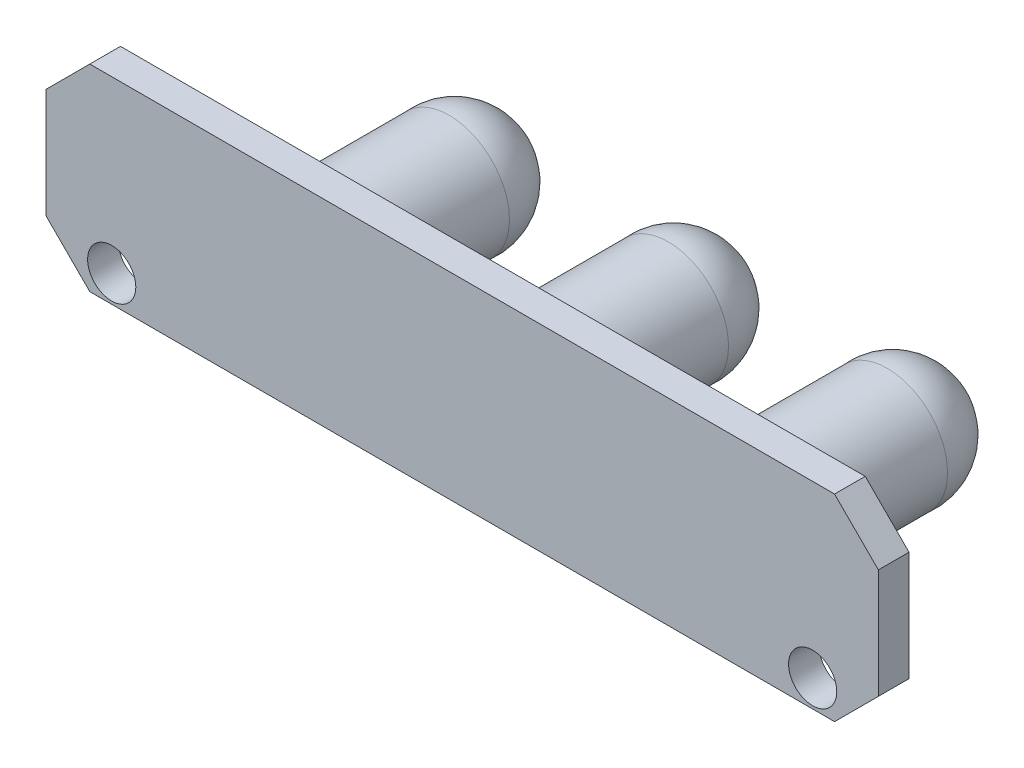
ISO-10303-21;
HEADER;
FILE_DESCRIPTION(('STEP AP214'),'2;1');
FILE_NAME('part.step','',(''),(''),'','','');
FILE_SCHEMA(('AUTOMOTIVE_DESIGN { 1 0 10303 214 1 1 1 1 }'));
ENDSEC;
DATA;
#1=APPLICATION_CONTEXT('core data for automotive mechanical design processes');
#2=APPLICATION_PROTOCOL_DEFINITION('international standard','automotive_design',2000,#1);
#3=PRODUCT_CONTEXT('',#1,'mechanical');
#4=PRODUCT('Part','Part','',(#3));
#5=PRODUCT_RELATED_PRODUCT_CATEGORY('part','',(#4));
#6=PRODUCT_DEFINITION_FORMATION('','',#4);
#7=PRODUCT_DEFINITION_CONTEXT('part definition',#1,'design');
#8=PRODUCT_DEFINITION('design','',#6,#7);
#9=PRODUCT_DEFINITION_SHAPE('','',#8);
#10=(LENGTH_UNIT() NAMED_UNIT(*) SI_UNIT(.MILLI.,.METRE.));
#11=(NAMED_UNIT(*) PLANE_ANGLE_UNIT() SI_UNIT($,.RADIAN.));
#12=(NAMED_UNIT(*) SI_UNIT($,.STERADIAN.) SOLID_ANGLE_UNIT());
#13=UNCERTAINTY_MEASURE_WITH_UNIT(LENGTH_MEASURE(1.E-05),#10,'distance_accuracy_value','');
#14=(GEOMETRIC_REPRESENTATION_CONTEXT(3) GLOBAL_UNCERTAINTY_ASSIGNED_CONTEXT((#13)) GLOBAL_UNIT_ASSIGNED_CONTEXT((#10,
#11,#12)) REPRESENTATION_CONTEXT('',''));
#15=CARTESIAN_POINT('',(0.,0.,0.));
#16=DIRECTION('',(0.,0.,1.));
#17=DIRECTION('',(1.,0.,0.));
#18=AXIS2_PLACEMENT_3D('',#15,#16,#17);
#19=CARTESIAN_POINT('',(-19.,17.3559497656977,0.));
#20=DIRECTION('',(0.,0.,-1.));
#21=DIRECTION('',(-1.,0.,0.));
#22=AXIS2_PLACEMENT_3D('',#19,#20,#21);
#23=PLANE('',#22);
#24=CARTESIAN_POINT('',(0.00720473933372518,11.3828191657656,0.));
#25=DIRECTION('',(0.,0.,-1.));
#26=DIRECTION('',(-1.,0.,0.));
#27=AXIS2_PLACEMENT_3D('',#24,#25,#26);
#28=CIRCLE('',#27,2.75);
#29=CARTESIAN_POINT('',(-2.74279526066627,11.3828191657656,0.));
#30=VERTEX_POINT('',#29);
#31=EDGE_CURVE('E171',#30,#30,#28,.T.);
#32=ORIENTED_EDGE('',*,*,#31,.F.);
#33=EDGE_LOOP('',(#32));
#34=FACE_BOUND('',#33,.T.);
#35=CARTESIAN_POINT('',(-16.,9.5846798827186,0.));
#36=DIRECTION('',(0.,0.,1.));
#37=DIRECTION('',(1.,0.,0.));
#38=AXIS2_PLACEMENT_3D('',#35,#36,#37);
#39=CIRCLE('',#38,1.1);
#40=CARTESIAN_POINT('',(-14.9,9.5846798827186,0.));
#41=VERTEX_POINT('',#40);
#42=EDGE_CURVE('E186',#41,#41,#39,.T.);
#43=ORIENTED_EDGE('',*,*,#42,.T.);
#44=EDGE_LOOP('',(#43));
#45=FACE_BOUND('',#44,.T.);
#46=DIRECTION('',(1.,0.,0.));
#47=VECTOR('',#46,1.);
#48=CARTESIAN_POINT('',(-19.,8.3559497656977,0.));
#49=LINE('',#48,#47);
#50=CARTESIAN_POINT('',(-17.,8.3559497656977,0.));
#51=VERTEX_POINT('',#50);
#52=CARTESIAN_POINT('',(17.,8.3559497656977,0.));
#53=VERTEX_POINT('',#52);
#54=EDGE_CURVE('E121',#51,#53,#49,.T.);
#55=ORIENTED_EDGE('',*,*,#54,.F.);
#56=DIRECTION('',(0.707106781186547,-0.707106781186549,0.));
#57=VECTOR('',#56,1.);
#58=CARTESIAN_POINT('',(-22.5,13.8559497656977,0.));
#59=LINE('',#58,#57);
#60=CARTESIAN_POINT('',(-19.,10.3559497656977,0.));
#61=VERTEX_POINT('',#60);
#62=EDGE_CURVE('E104',#51,#61,#59,.F.);
#63=ORIENTED_EDGE('',*,*,#62,.T.);
#64=DIRECTION('',(0.,-1.,0.));
#65=VECTOR('',#64,1.);
#66=CARTESIAN_POINT('',(-19.,8.3559497656977,0.));
#67=LINE('',#66,#65);
#68=CARTESIAN_POINT('',(-19.,15.3559497656977,0.));
#69=VERTEX_POINT('',#68);
#70=EDGE_CURVE('E132',#69,#61,#67,.T.);
#71=ORIENTED_EDGE('',*,*,#70,.F.);
#72=DIRECTION('',(-0.707106781186549,-0.707106781186546,0.));
#73=VECTOR('',#72,1.);
#74=CARTESIAN_POINT('',(-18.,16.3559497656977,0.));
#75=LINE('',#74,#73);
#76=CARTESIAN_POINT('',(-17.,17.3559497656977,0.));
#77=VERTEX_POINT('',#76);
#78=EDGE_CURVE('E115',#69,#77,#75,.F.);
#79=ORIENTED_EDGE('',*,*,#78,.T.);
#80=DIRECTION('',(-1.,0.,0.));
#81=VECTOR('',#80,1.);
#82=CARTESIAN_POINT('',(-19.,17.3559497656977,0.));
#83=LINE('',#82,#81);
#84=CARTESIAN_POINT('',(17.,17.3559497656977,0.));
#85=VERTEX_POINT('',#84);
#86=EDGE_CURVE('E135',#85,#77,#83,.T.);
#87=ORIENTED_EDGE('',*,*,#86,.F.);
#88=DIRECTION('',(-0.707106781186547,0.707106781186549,0.));
#89=VECTOR('',#88,1.);
#90=CARTESIAN_POINT('',(-0.999999999999952,35.3559497656977,0.));
#91=LINE('',#90,#89);
#92=CARTESIAN_POINT('',(19.,15.3559497656977,0.));
#93=VERTEX_POINT('',#92);
#94=EDGE_CURVE('E125',#85,#93,#91,.F.);
#95=ORIENTED_EDGE('',*,*,#94,.T.);
#96=DIRECTION('',(0.,1.,0.));
#97=VECTOR('',#96,1.);
#98=CARTESIAN_POINT('',(19.,8.3559497656977,0.));
#99=LINE('',#98,#97);
#100=CARTESIAN_POINT('',(19.,10.3559497656977,0.));
#101=VERTEX_POINT('',#100);
#102=EDGE_CURVE('E131',#101,#93,#99,.T.);
#103=ORIENTED_EDGE('',*,*,#102,.F.);
#104=DIRECTION('',(0.707106781186549,0.707106781186546,0.));
#105=VECTOR('',#104,1.);
#106=CARTESIAN_POINT('',(3.49999999999991,-5.14405023430232,0.));
#107=LINE('',#106,#105);
#108=EDGE_CURVE('E130',#101,#53,#107,.F.);
#109=ORIENTED_EDGE('',*,*,#108,.T.);
#110=EDGE_LOOP('',(#55,#63,#71,#79,#87,#95,#103,#109));
#111=FACE_BOUND('',#110,.T.);
#112=CARTESIAN_POINT('',(16.,9.5846798827186,0.));
#113=DIRECTION('',(0.,0.,1.));
#114=DIRECTION('',(1.,0.,0.));
#115=AXIS2_PLACEMENT_3D('',#112,#113,#114);
#116=CIRCLE('',#115,1.1);
#117=CARTESIAN_POINT('',(17.1,9.5846798827186,0.));
#118=VERTEX_POINT('',#117);
#119=EDGE_CURVE('E192',#118,#118,#116,.T.);
#120=ORIENTED_EDGE('',*,*,#119,.T.);
#121=EDGE_LOOP('',(#120));
#122=FACE_BOUND('',#121,.T.);
#123=CARTESIAN_POINT('',(10.0072044186483,11.3802866356671,0.));
#124=DIRECTION('',(0.,0.,-1.));
#125=DIRECTION('',(-1.,0.,0.));
#126=AXIS2_PLACEMENT_3D('',#123,#124,#125);
#127=CIRCLE('',#126,2.75);
#128=CARTESIAN_POINT('',(7.25720441864829,11.3802866356671,0.));
#129=VERTEX_POINT('',#128);
#130=EDGE_CURVE('E175',#129,#129,#127,.T.);
#131=ORIENTED_EDGE('',*,*,#130,.F.);
#132=EDGE_LOOP('',(#131));
#133=FACE_BOUND('',#132,.T.);
#134=CARTESIAN_POINT('',(-9.99279493998084,11.3853516958641,0.));
#135=DIRECTION('',(0.,0.,-1.));
#136=DIRECTION('',(-1.,0.,0.));
#137=AXIS2_PLACEMENT_3D('',#134,#135,#136);
#138=CIRCLE('',#137,2.75);
#139=CARTESIAN_POINT('',(-12.7427949399808,11.3853516958641,0.));
#140=VERTEX_POINT('',#139);
#141=EDGE_CURVE('E172',#140,#140,#138,.T.);
#142=ORIENTED_EDGE('',*,*,#141,.F.);
#143=EDGE_LOOP('',(#142));
#144=FACE_BOUND('',#143,.T.);
#145=ADVANCED_FACE('F35',(#34,#45,#111,#122,#133,#144),#23,.T.);
#146=CARTESIAN_POINT('',(-19.,17.3559497656977,1.4));
#147=DIRECTION('',(0.,0.,-1.));
#148=DIRECTION('',(-1.,0.,0.));
#149=AXIS2_PLACEMENT_3D('',#146,#147,#148);
#150=PLANE('',#149);
#151=CARTESIAN_POINT('',(16.,9.5846798827186,1.4));
#152=DIRECTION('',(0.,0.,1.));
#153=DIRECTION('',(1.,0.,0.));
#154=AXIS2_PLACEMENT_3D('',#151,#152,#153);
#155=CIRCLE('',#154,1.1);
#156=CARTESIAN_POINT('',(17.1,9.5846798827186,1.4));
#157=VERTEX_POINT('',#156);
#158=EDGE_CURVE('E137',#157,#157,#155,.T.);
#159=ORIENTED_EDGE('',*,*,#158,.F.);
#160=EDGE_LOOP('',(#159));
#161=FACE_BOUND('',#160,.T.);
#162=DIRECTION('',(0.,-1.,0.));
#163=VECTOR('',#162,1.);
#164=CARTESIAN_POINT('',(-19.,8.3559497656977,1.4));
#165=LINE('',#164,#163);
#166=CARTESIAN_POINT('',(-19.,15.3559497656977,1.4));
#167=VERTEX_POINT('',#166);
#168=CARTESIAN_POINT('',(-19.,10.3559497656977,1.4));
#169=VERTEX_POINT('',#168);
#170=EDGE_CURVE('E142',#167,#169,#165,.T.);
#171=ORIENTED_EDGE('',*,*,#170,.T.);
#172=DIRECTION('',(-0.707106781186547,0.707106781186549,0.));
#173=VECTOR('',#172,1.);
#174=CARTESIAN_POINT('',(-17.,8.3559497656977,1.4));
#175=LINE('',#174,#173);
#176=CARTESIAN_POINT('',(-17.,8.3559497656977,1.4));
#177=VERTEX_POINT('',#176);
#178=EDGE_CURVE('E162',#169,#177,#175,.F.);
#179=ORIENTED_EDGE('',*,*,#178,.T.);
#180=DIRECTION('',(1.,0.,0.));
#181=VECTOR('',#180,1.);
#182=CARTESIAN_POINT('',(-19.,8.3559497656977,1.4));
#183=LINE('',#182,#181);
#184=CARTESIAN_POINT('',(17.,8.3559497656977,1.4));
#185=VERTEX_POINT('',#184);
#186=EDGE_CURVE('E124',#177,#185,#183,.T.);
#187=ORIENTED_EDGE('',*,*,#186,.T.);
#188=DIRECTION('',(-0.707106781186549,-0.707106781186546,0.));
#189=VECTOR('',#188,1.);
#190=CARTESIAN_POINT('',(19.,10.3559497656977,1.4));
#191=LINE('',#190,#189);
#192=CARTESIAN_POINT('',(19.,10.3559497656977,1.4));
#193=VERTEX_POINT('',#192);
#194=EDGE_CURVE('E158',#185,#193,#191,.F.);
#195=ORIENTED_EDGE('',*,*,#194,.T.);
#196=DIRECTION('',(0.,1.,0.));
#197=VECTOR('',#196,1.);
#198=CARTESIAN_POINT('',(19.,8.3559497656977,1.4));
#199=LINE('',#198,#197);
#200=CARTESIAN_POINT('',(19.,15.3559497656977,1.4));
#201=VERTEX_POINT('',#200);
#202=EDGE_CURVE('E146',#193,#201,#199,.T.);
#203=ORIENTED_EDGE('',*,*,#202,.T.);
#204=DIRECTION('',(0.707106781186547,-0.707106781186549,0.));
#205=VECTOR('',#204,1.);
#206=CARTESIAN_POINT('',(17.,17.3559497656977,1.4));
#207=LINE('',#206,#205);
#208=CARTESIAN_POINT('',(17.,17.3559497656977,1.4));
#209=VERTEX_POINT('',#208);
#210=EDGE_CURVE('E59',#201,#209,#207,.F.);
#211=ORIENTED_EDGE('',*,*,#210,.T.);
#212=DIRECTION('',(-1.,0.,0.));
#213=VECTOR('',#212,1.);
#214=CARTESIAN_POINT('',(-19.,17.3559497656977,1.4));
#215=LINE('',#214,#213);
#216=CARTESIAN_POINT('',(-17.,17.3559497656977,1.4));
#217=VERTEX_POINT('',#216);
#218=EDGE_CURVE('E148',#209,#217,#215,.T.);
#219=ORIENTED_EDGE('',*,*,#218,.T.);
#220=DIRECTION('',(0.707106781186549,0.707106781186546,0.));
#221=VECTOR('',#220,1.);
#222=CARTESIAN_POINT('',(-19.,15.3559497656977,1.4));
#223=LINE('',#222,#221);
#224=EDGE_CURVE('E160',#217,#167,#223,.F.);
#225=ORIENTED_EDGE('',*,*,#224,.T.);
#226=EDGE_LOOP('',(#171,#179,#187,#195,#203,#211,#219,#225));
#227=FACE_BOUND('',#226,.T.);
#228=CARTESIAN_POINT('',(-16.,9.5846798827186,1.4));
#229=DIRECTION('',(0.,0.,1.));
#230=DIRECTION('',(1.,0.,0.));
#231=AXIS2_PLACEMENT_3D('',#228,#229,#230);
#232=CIRCLE('',#231,1.1);
#233=CARTESIAN_POINT('',(-14.9,9.5846798827186,1.4));
#234=VERTEX_POINT('',#233);
#235=EDGE_CURVE('E189',#234,#234,#232,.T.);
#236=ORIENTED_EDGE('',*,*,#235,.F.);
#237=EDGE_LOOP('',(#236));
#238=FACE_BOUND('',#237,.T.);
#239=ADVANCED_FACE('F200',(#161,#227,#238),#150,.F.);
#240=CARTESIAN_POINT('',(-19.,8.3559497656977,1.4));
#241=DIRECTION('',(1.,0.,0.));
#242=DIRECTION('',(0.,0.,-1.));
#243=AXIS2_PLACEMENT_3D('',#240,#241,#242);
#244=PLANE('',#243);
#245=ORIENTED_EDGE('',*,*,#70,.T.);
#246=DIRECTION('',(0.,0.,1.));
#247=VECTOR('',#246,1.);
#248=CARTESIAN_POINT('',(-19.,10.3559497656977,1.4));
#249=LINE('',#248,#247);
#250=EDGE_CURVE('E109',#61,#169,#249,.T.);
#251=ORIENTED_EDGE('',*,*,#250,.T.);
#252=ORIENTED_EDGE('',*,*,#170,.F.);
#253=DIRECTION('',(0.,0.,-1.));
#254=VECTOR('',#253,1.);
#255=CARTESIAN_POINT('',(-19.,15.3559497656977,1.4));
#256=LINE('',#255,#254);
#257=EDGE_CURVE('E114',#167,#69,#256,.T.);
#258=ORIENTED_EDGE('',*,*,#257,.T.);
#259=EDGE_LOOP('',(#245,#251,#252,#258));
#260=FACE_BOUND('',#259,.T.);
#261=ADVANCED_FACE('F202',(#260),#244,.F.);
#262=CARTESIAN_POINT('',(-19.,8.3559497656977,1.4));
#263=DIRECTION('',(0.,1.,0.));
#264=DIRECTION('',(0.,0.,1.));
#265=AXIS2_PLACEMENT_3D('',#262,#263,#264);
#266=PLANE('',#265);
#267=ORIENTED_EDGE('',*,*,#186,.F.);
#268=DIRECTION('',(0.,0.,-1.));
#269=VECTOR('',#268,1.);
#270=CARTESIAN_POINT('',(-17.,8.3559497656977,1.4));
#271=LINE('',#270,#269);
#272=EDGE_CURVE('E108',#177,#51,#271,.T.);
#273=ORIENTED_EDGE('',*,*,#272,.T.);
#274=ORIENTED_EDGE('',*,*,#54,.T.);
#275=DIRECTION('',(0.,0.,1.));
#276=VECTOR('',#275,1.);
#277=CARTESIAN_POINT('',(17.,8.3559497656977,1.4));
#278=LINE('',#277,#276);
#279=EDGE_CURVE('E126',#53,#185,#278,.T.);
#280=ORIENTED_EDGE('',*,*,#279,.T.);
#281=EDGE_LOOP('',(#267,#273,#274,#280));
#282=FACE_BOUND('',#281,.T.);
#283=ADVANCED_FACE('F120',(#282),#266,.F.);
#284=CARTESIAN_POINT('',(19.,8.3559497656977,1.4));
#285=DIRECTION('',(-1.,0.,0.));
#286=DIRECTION('',(0.,0.,1.));
#287=AXIS2_PLACEMENT_3D('',#284,#285,#286);
#288=PLANE('',#287);
#289=ORIENTED_EDGE('',*,*,#202,.F.);
#290=DIRECTION('',(0.,0.,-1.));
#291=VECTOR('',#290,1.);
#292=CARTESIAN_POINT('',(19.,10.3559497656977,1.4));
#293=LINE('',#292,#291);
#294=EDGE_CURVE('E11',#193,#101,#293,.T.);
#295=ORIENTED_EDGE('',*,*,#294,.T.);
#296=ORIENTED_EDGE('',*,*,#102,.T.);
#297=DIRECTION('',(0.,0.,1.));
#298=VECTOR('',#297,1.);
#299=CARTESIAN_POINT('',(19.,15.3559497656977,1.4));
#300=LINE('',#299,#298);
#301=EDGE_CURVE('E44',#93,#201,#300,.T.);
#302=ORIENTED_EDGE('',*,*,#301,.T.);
#303=EDGE_LOOP('',(#289,#295,#296,#302));
#304=FACE_BOUND('',#303,.T.);
#305=ADVANCED_FACE('F224',(#304),#288,.F.);
#306=CARTESIAN_POINT('',(-19.,17.3559497656977,1.4));
#307=DIRECTION('',(0.,-1.,0.));
#308=DIRECTION('',(0.,0.,-1.));
#309=AXIS2_PLACEMENT_3D('',#306,#307,#308);
#310=PLANE('',#309);
#311=ORIENTED_EDGE('',*,*,#86,.T.);
#312=DIRECTION('',(0.,0.,1.));
#313=VECTOR('',#312,1.);
#314=CARTESIAN_POINT('',(-17.,17.3559497656977,1.4));
#315=LINE('',#314,#313);
#316=EDGE_CURVE('E52',#77,#217,#315,.T.);
#317=ORIENTED_EDGE('',*,*,#316,.T.);
#318=ORIENTED_EDGE('',*,*,#218,.F.);
#319=DIRECTION('',(0.,0.,-1.));
#320=VECTOR('',#319,1.);
#321=CARTESIAN_POINT('',(17.,17.3559497656977,1.4));
#322=LINE('',#321,#320);
#323=EDGE_CURVE('E164',#209,#85,#322,.T.);
#324=ORIENTED_EDGE('',*,*,#323,.T.);
#325=EDGE_LOOP('',(#311,#317,#318,#324));
#326=FACE_BOUND('',#325,.T.);
#327=ADVANCED_FACE('F221',(#326),#310,.F.);
#328=CARTESIAN_POINT('',(16.,9.5846798827186,1.4));
#329=DIRECTION('',(0.,0.,-1.));
#330=DIRECTION('',(-1.,0.,0.));
#331=AXIS2_PLACEMENT_3D('',#328,#329,#330);
#332=CYLINDRICAL_SURFACE('',#331,1.1);
#333=ORIENTED_EDGE('',*,*,#158,.T.);
#334=EDGE_LOOP('',(#333));
#335=FACE_BOUND('',#334,.T.);
#336=ORIENTED_EDGE('',*,*,#119,.F.);
#337=EDGE_LOOP('',(#336));
#338=FACE_BOUND('',#337,.T.);
#339=ADVANCED_FACE('F197',(#335,#338),#332,.F.);
#340=CARTESIAN_POINT('',(-16.,9.5846798827186,1.4));
#341=DIRECTION('',(0.,0.,-1.));
#342=DIRECTION('',(-1.,0.,0.));
#343=AXIS2_PLACEMENT_3D('',#340,#341,#342);
#344=CYLINDRICAL_SURFACE('',#343,1.1);
#345=ORIENTED_EDGE('',*,*,#235,.T.);
#346=EDGE_LOOP('',(#345));
#347=FACE_BOUND('',#346,.T.);
#348=ORIENTED_EDGE('',*,*,#42,.F.);
#349=EDGE_LOOP('',(#348));
#350=FACE_BOUND('',#349,.T.);
#351=ADVANCED_FACE('F208',(#347,#350),#344,.F.);
#352=CARTESIAN_POINT('',(-17.,8.3559497656977,1.4));
#353=DIRECTION('',(0.707106781186549,0.707106781186547,0.));
#354=DIRECTION('',(-0.707106781186547,0.707106781186549,0.));
#355=AXIS2_PLACEMENT_3D('',#352,#353,#354);
#356=PLANE('',#355);
#357=ORIENTED_EDGE('',*,*,#178,.F.);
#358=ORIENTED_EDGE('',*,*,#250,.F.);
#359=ORIENTED_EDGE('',*,*,#62,.F.);
#360=ORIENTED_EDGE('',*,*,#272,.F.);
#361=EDGE_LOOP('',(#357,#358,#359,#360));
#362=FACE_BOUND('',#361,.T.);
#363=ADVANCED_FACE('F107',(#362),#356,.F.);
#364=CARTESIAN_POINT('',(-19.,15.3559497656977,1.4));
#365=DIRECTION('',(0.707106781186546,-0.707106781186549,0.));
#366=DIRECTION('',(0.707106781186549,0.707106781186546,0.));
#367=AXIS2_PLACEMENT_3D('',#364,#365,#366);
#368=PLANE('',#367);
#369=ORIENTED_EDGE('',*,*,#224,.F.);
#370=ORIENTED_EDGE('',*,*,#316,.F.);
#371=ORIENTED_EDGE('',*,*,#78,.F.);
#372=ORIENTED_EDGE('',*,*,#257,.F.);
#373=EDGE_LOOP('',(#369,#370,#371,#372));
#374=FACE_BOUND('',#373,.T.);
#375=ADVANCED_FACE('F264',(#374),#368,.F.);
#376=CARTESIAN_POINT('',(19.,10.3559497656977,1.4));
#377=DIRECTION('',(-0.707106781186546,0.707106781186549,0.));
#378=DIRECTION('',(-0.707106781186549,-0.707106781186546,0.));
#379=AXIS2_PLACEMENT_3D('',#376,#377,#378);
#380=PLANE('',#379);
#381=ORIENTED_EDGE('',*,*,#194,.F.);
#382=ORIENTED_EDGE('',*,*,#279,.F.);
#383=ORIENTED_EDGE('',*,*,#108,.F.);
#384=ORIENTED_EDGE('',*,*,#294,.F.);
#385=EDGE_LOOP('',(#381,#382,#383,#384));
#386=FACE_BOUND('',#385,.T.);
#387=ADVANCED_FACE('F260',(#386),#380,.F.);
#388=CARTESIAN_POINT('',(17.,17.3559497656977,1.4));
#389=DIRECTION('',(-0.707106781186549,-0.707106781186547,0.));
#390=DIRECTION('',(0.707106781186547,-0.707106781186549,0.));
#391=AXIS2_PLACEMENT_3D('',#388,#389,#390);
#392=PLANE('',#391);
#393=ORIENTED_EDGE('',*,*,#210,.F.);
#394=ORIENTED_EDGE('',*,*,#301,.F.);
#395=ORIENTED_EDGE('',*,*,#94,.F.);
#396=ORIENTED_EDGE('',*,*,#323,.F.);
#397=EDGE_LOOP('',(#393,#394,#395,#396));
#398=FACE_BOUND('',#397,.T.);
#399=ADVANCED_FACE('F256',(#398),#392,.F.);
#400=CARTESIAN_POINT('',(10.0072044186483,11.3802866356671,-8.));
#401=DIRECTION('',(0.,0.,1.));
#402=DIRECTION('',(1.,0.,0.));
#403=AXIS2_PLACEMENT_3D('',#400,#401,#402);
#404=CYLINDRICAL_SURFACE('',#403,2.75);
#405=CARTESIAN_POINT('',(10.0072044186483,11.3802866356671,-8.));
#406=DIRECTION('',(0.,0.,-1.));
#407=DIRECTION('',(-1.,0.,0.));
#408=AXIS2_PLACEMENT_3D('',#405,#406,#407);
#409=CIRCLE('',#408,2.75);
#410=CARTESIAN_POINT('',(7.25720441864829,11.3802866356671,-8.));
#411=VERTEX_POINT('',#410);
#412=EDGE_CURVE('E39',#411,#411,#409,.T.);
#413=ORIENTED_EDGE('',*,*,#412,.F.);
#414=EDGE_LOOP('',(#413));
#415=FACE_BOUND('',#414,.T.);
#416=ORIENTED_EDGE('',*,*,#130,.T.);
#417=EDGE_LOOP('',(#416));
#418=FACE_BOUND('',#417,.T.);
#419=ADVANCED_FACE('F251',(#415,#418),#404,.T.);
#420=CARTESIAN_POINT('',(10.0072044186483,11.3802866356671,-8.23958333333334));
#421=DIRECTION('',(0.,0.,1.));
#422=DIRECTION('',(1.,0.,0.));
#423=AXIS2_PLACEMENT_3D('',#420,#421,#422);
#424=SPHERICAL_SURFACE('',#423,2.76041666666666);
#425=ORIENTED_EDGE('',*,*,#412,.T.);
#426=EDGE_LOOP('',(#425));
#427=FACE_BOUND('',#426,.T.);
#428=ADVANCED_FACE('F37',(#427),#424,.T.);
#429=CARTESIAN_POINT('',(0.00720473933372518,11.3828191657656,-8.));
#430=DIRECTION('',(0.,0.,1.));
#431=DIRECTION('',(1.,0.,0.));
#432=AXIS2_PLACEMENT_3D('',#429,#430,#431);
#433=CYLINDRICAL_SURFACE('',#432,2.75);
#434=CARTESIAN_POINT('',(0.00720473933372518,11.3828191657656,-8.));
#435=DIRECTION('',(0.,0.,-1.));
#436=DIRECTION('',(-1.,0.,0.));
#437=AXIS2_PLACEMENT_3D('',#434,#435,#436);
#438=CIRCLE('',#437,2.75);
#439=CARTESIAN_POINT('',(-2.74279526066627,11.3828191657656,-8.));
#440=VERTEX_POINT('',#439);
#441=EDGE_CURVE('E173',#440,#440,#438,.T.);
#442=ORIENTED_EDGE('',*,*,#441,.F.);
#443=EDGE_LOOP('',(#442));
#444=FACE_BOUND('',#443,.T.);
#445=ORIENTED_EDGE('',*,*,#31,.T.);
#446=EDGE_LOOP('',(#445));
#447=FACE_BOUND('',#446,.T.);
#448=ADVANCED_FACE('F239',(#444,#447),#433,.T.);
#449=CARTESIAN_POINT('',(0.00720473933372518,11.3828191657656,-8.23958333333334));
#450=DIRECTION('',(0.,0.,1.));
#451=DIRECTION('',(1.,0.,0.));
#452=AXIS2_PLACEMENT_3D('',#449,#450,#451);
#453=SPHERICAL_SURFACE('',#452,2.76041666666666);
#454=ORIENTED_EDGE('',*,*,#441,.T.);
#455=EDGE_LOOP('',(#454));
#456=FACE_BOUND('',#455,.T.);
#457=ADVANCED_FACE('F237',(#456),#453,.T.);
#458=CARTESIAN_POINT('',(-9.99279493998084,11.3853516958641,-8.));
#459=DIRECTION('',(0.,0.,1.));
#460=DIRECTION('',(1.,0.,0.));
#461=AXIS2_PLACEMENT_3D('',#458,#459,#460);
#462=CYLINDRICAL_SURFACE('',#461,2.75);
#463=CARTESIAN_POINT('',(-9.99279493998084,11.3853516958641,-8.));
#464=DIRECTION('',(0.,0.,-1.));
#465=DIRECTION('',(-1.,0.,0.));
#466=AXIS2_PLACEMENT_3D('',#463,#464,#465);
#467=CIRCLE('',#466,2.75);
#468=CARTESIAN_POINT('',(-12.7427949399808,11.3853516958641,-8.));
#469=VERTEX_POINT('',#468);
#470=EDGE_CURVE('E169',#469,#469,#467,.T.);
#471=ORIENTED_EDGE('',*,*,#470,.F.);
#472=EDGE_LOOP('',(#471));
#473=FACE_BOUND('',#472,.T.);
#474=ORIENTED_EDGE('',*,*,#141,.T.);
#475=EDGE_LOOP('',(#474));
#476=FACE_BOUND('',#475,.T.);
#477=ADVANCED_FACE('F235',(#473,#476),#462,.T.);
#478=CARTESIAN_POINT('',(-9.99279493998084,11.3853516958641,-8.23958333333334));
#479=DIRECTION('',(0.,0.,1.));
#480=DIRECTION('',(1.,0.,0.));
#481=AXIS2_PLACEMENT_3D('',#478,#479,#480);
#482=SPHERICAL_SURFACE('',#481,2.76041666666666);
#483=ORIENTED_EDGE('',*,*,#470,.T.);
#484=EDGE_LOOP('',(#483));
#485=FACE_BOUND('',#484,.T.);
#486=ADVANCED_FACE('F233',(#485),#482,.T.);
#487=CLOSED_SHELL('',(#145,#239,#261,#283,#305,#327,#339,#351,#363,#375,#387,#399,#419,#428,
#448,#457,#477,#486));
#488=MANIFOLD_SOLID_BREP('B2',#487);
#489=ADVANCED_BREP_SHAPE_REPRESENTATION('',(#18,#488),#14);
#490=SHAPE_DEFINITION_REPRESENTATION(#9,#489);
ENDSEC;
END-ISO-10303-21;
